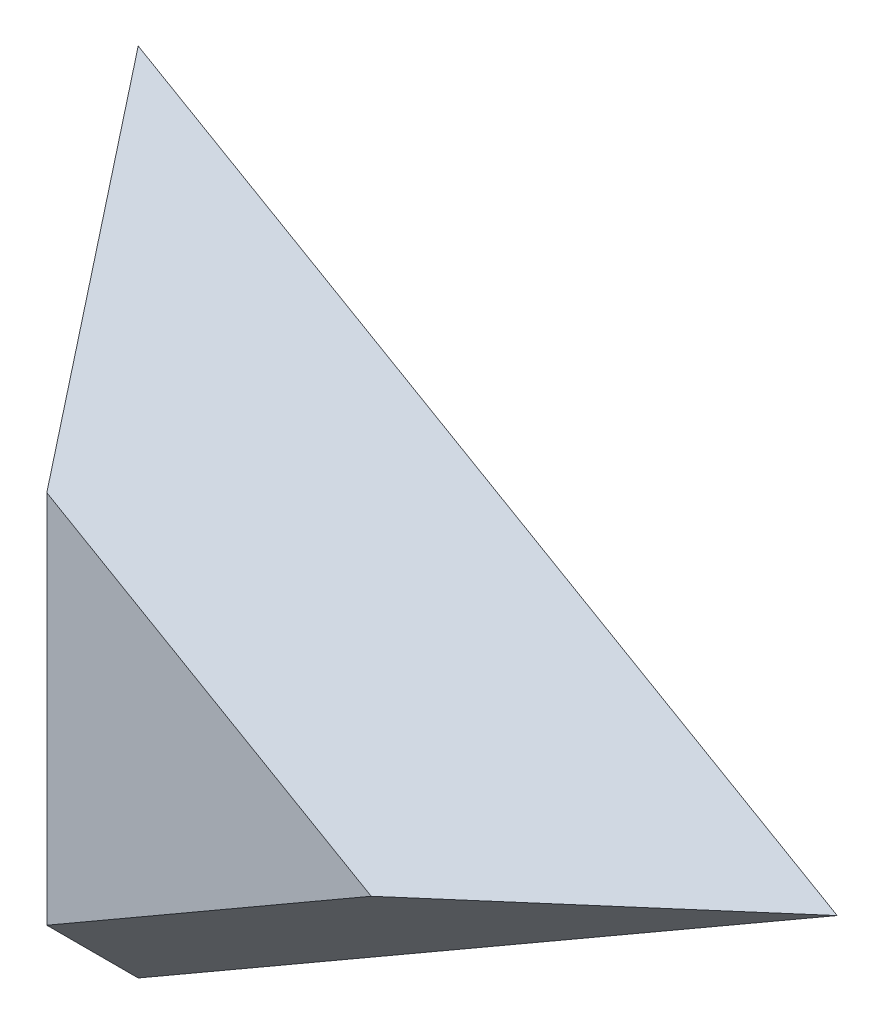
ISO-10303-21;
HEADER;
FILE_DESCRIPTION(('STEP AP214'),'2;1');
FILE_NAME('part.step','',(''),(''),'','','');
FILE_SCHEMA(('AUTOMOTIVE_DESIGN { 1 0 10303 214 1 1 1 1 }'));
ENDSEC;
DATA;
#1=APPLICATION_CONTEXT('core data for automotive mechanical design processes');
#2=APPLICATION_PROTOCOL_DEFINITION('international standard','automotive_design',2000,#1);
#3=PRODUCT_CONTEXT('',#1,'mechanical');
#4=PRODUCT('Part','Part','',(#3));
#5=PRODUCT_RELATED_PRODUCT_CATEGORY('part','',(#4));
#6=PRODUCT_DEFINITION_FORMATION('','',#4);
#7=PRODUCT_DEFINITION_CONTEXT('part definition',#1,'design');
#8=PRODUCT_DEFINITION('design','',#6,#7);
#9=PRODUCT_DEFINITION_SHAPE('','',#8);
#10=(LENGTH_UNIT() NAMED_UNIT(*) SI_UNIT(.MILLI.,.METRE.));
#11=(NAMED_UNIT(*) PLANE_ANGLE_UNIT() SI_UNIT($,.RADIAN.));
#12=(NAMED_UNIT(*) SI_UNIT($,.STERADIAN.) SOLID_ANGLE_UNIT());
#13=UNCERTAINTY_MEASURE_WITH_UNIT(LENGTH_MEASURE(1.E-05),#10,'distance_accuracy_value','');
#14=(GEOMETRIC_REPRESENTATION_CONTEXT(3) GLOBAL_UNCERTAINTY_ASSIGNED_CONTEXT((#13)) GLOBAL_UNIT_ASSIGNED_CONTEXT((#10,
#11,#12)) REPRESENTATION_CONTEXT('',''));
#15=CARTESIAN_POINT('',(0.,0.,0.));
#16=DIRECTION('',(0.,0.,1.));
#17=DIRECTION('',(1.,0.,0.));
#18=AXIS2_PLACEMENT_3D('',#15,#16,#17);
#19=CARTESIAN_POINT('',(-15.,-25.9807621135332,15.));
#20=DIRECTION('',(0.433012701892219,-0.75,0.500000000000001));
#21=DIRECTION('',(0.,-0.55470019622523,-0.832050294337843));
#22=AXIS2_PLACEMENT_3D('',#19,#20,#21);
#23=PLANE('',#22);
#24=DIRECTION('',(-0.866025403784439,-0.5,0.));
#25=VECTOR('',#24,1.);
#26=CARTESIAN_POINT('',(-6.3397459621556,-40.9807621135332,-15.));
#27=LINE('',#26,#25);
#28=CARTESIAN_POINT('',(-32.3205080756888,-55.9807621135333,-15.));
#29=VERTEX_POINT('',#28);
#30=CARTESIAN_POINT('',(64.6410161513776,0.,-15.));
#31=VERTEX_POINT('',#30);
#32=EDGE_CURVE('E77',#29,#31,#27,.F.);
#33=ORIENTED_EDGE('',*,*,#32,.T.);
#34=DIRECTION('',(0.755928946018455,0.,-0.654653670707976));
#35=VECTOR('',#34,1.);
#36=CARTESIAN_POINT('',(30.,0.,15.));
#37=LINE('',#36,#35);
#38=CARTESIAN_POINT('',(30.,0.,15.));
#39=VERTEX_POINT('',#38);
#40=EDGE_CURVE('E11',#39,#31,#37,.T.);
#41=ORIENTED_EDGE('',*,*,#40,.F.);
#42=DIRECTION('',(0.866025403784439,0.5,0.));
#43=VECTOR('',#42,1.);
#44=CARTESIAN_POINT('',(-15.,-25.9807621135332,15.));
#45=LINE('',#44,#43);
#46=CARTESIAN_POINT('',(-15.,-25.9807621135332,15.));
#47=VERTEX_POINT('',#46);
#48=EDGE_CURVE('E89',#47,#39,#45,.T.);
#49=ORIENTED_EDGE('',*,*,#48,.F.);
#50=DIRECTION('',(-0.377964473009228,-0.654653670707978,-0.654653670707976));
#51=VECTOR('',#50,1.);
#52=CARTESIAN_POINT('',(-15.,-25.9807621135332,15.));
#53=LINE('',#52,#51);
#54=EDGE_CURVE('E85',#47,#29,#53,.T.);
#55=ORIENTED_EDGE('',*,*,#54,.T.);
#56=EDGE_LOOP('',(#33,#41,#49,#55));
#57=FACE_BOUND('',#56,.T.);
#58=ADVANCED_FACE('F39',(#57),#23,.T.);
#59=CARTESIAN_POINT('',(30.,0.,15.));
#60=DIRECTION('',(0.433012701892219,0.75,0.500000000000001));
#61=DIRECTION('',(0.,-0.55470019622523,0.832050294337843));
#62=AXIS2_PLACEMENT_3D('',#59,#60,#61);
#63=PLANE('',#62);
#64=DIRECTION('',(0.866025403784439,-0.5,0.));
#65=VECTOR('',#64,1.);
#66=CARTESIAN_POINT('',(38.6602540378444,15.,-15.));
#67=LINE('',#66,#65);
#68=CARTESIAN_POINT('',(-32.3205080756888,55.9807621135332,-15.));
#69=VERTEX_POINT('',#68);
#70=EDGE_CURVE('E43',#31,#69,#67,.F.);
#71=ORIENTED_EDGE('',*,*,#70,.T.);
#72=DIRECTION('',(-0.377964473009227,0.654653670707978,-0.654653670707976));
#73=VECTOR('',#72,1.);
#74=CARTESIAN_POINT('',(-15.,25.9807621135332,15.));
#75=LINE('',#74,#73);
#76=CARTESIAN_POINT('',(-15.,25.9807621135332,15.));
#77=VERTEX_POINT('',#76);
#78=EDGE_CURVE('E49',#77,#69,#75,.T.);
#79=ORIENTED_EDGE('',*,*,#78,.F.);
#80=DIRECTION('',(-0.866025403784439,0.5,0.));
#81=VECTOR('',#80,1.);
#82=CARTESIAN_POINT('',(30.,0.,15.));
#83=LINE('',#82,#81);
#84=EDGE_CURVE('E81',#39,#77,#83,.T.);
#85=ORIENTED_EDGE('',*,*,#84,.F.);
#86=ORIENTED_EDGE('',*,*,#40,.T.);
#87=EDGE_LOOP('',(#71,#79,#85,#86));
#88=FACE_BOUND('',#87,.T.);
#89=ADVANCED_FACE('F41',(#88),#63,.T.);
#90=CARTESIAN_POINT('',(-15.,25.9807621135332,15.));
#91=DIRECTION('',(-0.866025403784438,0.,0.500000000000001));
#92=DIRECTION('',(0.500000000000001,0.,0.866025403784438));
#93=AXIS2_PLACEMENT_3D('',#90,#91,#92);
#94=PLANE('',#93);
#95=DIRECTION('',(0.,1.,0.));
#96=VECTOR('',#95,1.);
#97=CARTESIAN_POINT('',(-32.3205080756888,25.9807621135332,-15.));
#98=LINE('',#97,#96);
#99=EDGE_CURVE('E78',#69,#29,#98,.F.);
#100=ORIENTED_EDGE('',*,*,#99,.T.);
#101=ORIENTED_EDGE('',*,*,#54,.F.);
#102=DIRECTION('',(0.,-1.,0.));
#103=VECTOR('',#102,1.);
#104=CARTESIAN_POINT('',(-15.,25.9807621135332,15.));
#105=LINE('',#104,#103);
#106=EDGE_CURVE('E58',#77,#47,#105,.T.);
#107=ORIENTED_EDGE('',*,*,#106,.F.);
#108=ORIENTED_EDGE('',*,*,#78,.T.);
#109=EDGE_LOOP('',(#100,#101,#107,#108));
#110=FACE_BOUND('',#109,.T.);
#111=ADVANCED_FACE('F94',(#110),#94,.T.);
#112=CARTESIAN_POINT('',(0.,0.,15.));
#113=DIRECTION('',(0.,0.,1.));
#114=DIRECTION('',(1.,0.,0.));
#115=AXIS2_PLACEMENT_3D('',#112,#113,#114);
#116=PLANE('',#115);
#117=ORIENTED_EDGE('',*,*,#48,.T.);
#118=ORIENTED_EDGE('',*,*,#84,.T.);
#119=ORIENTED_EDGE('',*,*,#106,.T.);
#120=EDGE_LOOP('',(#117,#118,#119));
#121=FACE_BOUND('',#120,.T.);
#122=ADVANCED_FACE('F96',(#121),#116,.T.);
#123=CARTESIAN_POINT('',(0.,0.,-15.));
#124=DIRECTION('',(0.,0.,1.));
#125=DIRECTION('',(1.,0.,0.));
#126=AXIS2_PLACEMENT_3D('',#123,#124,#125);
#127=PLANE('',#126);
#128=ORIENTED_EDGE('',*,*,#32,.F.);
#129=ORIENTED_EDGE('',*,*,#99,.F.);
#130=ORIENTED_EDGE('',*,*,#70,.F.);
#131=EDGE_LOOP('',(#128,#129,#130));
#132=FACE_BOUND('',#131,.T.);
#133=ADVANCED_FACE('F75',(#132),#127,.F.);
#134=CLOSED_SHELL('',(#58,#89,#111,#122,#133));
#135=MANIFOLD_SOLID_BREP('B2',#134);
#136=ADVANCED_BREP_SHAPE_REPRESENTATION('',(#18,#135),#14);
#137=SHAPE_DEFINITION_REPRESENTATION(#9,#136);
ENDSEC;
END-ISO-10303-21;
